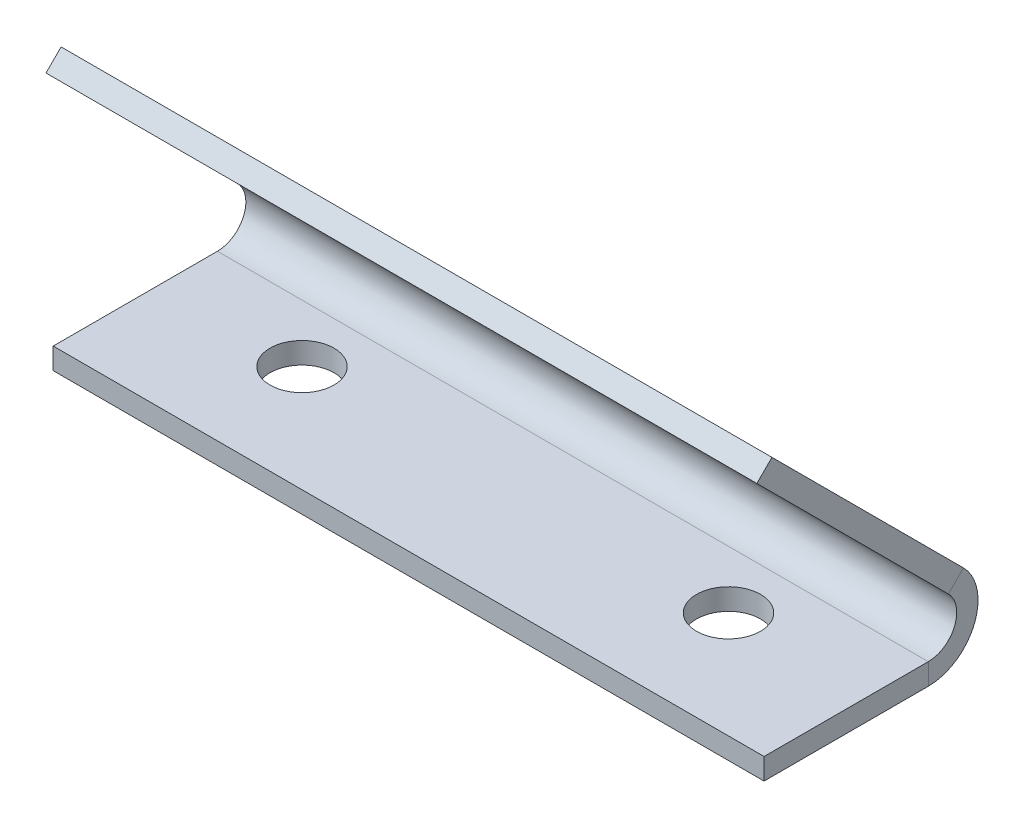
ISO-10303-21;
HEADER;
FILE_DESCRIPTION(('STEP AP214'),'2;1');
FILE_NAME('part.step','',(''),(''),'','','');
FILE_SCHEMA(('AUTOMOTIVE_DESIGN { 1 0 10303 214 1 1 1 1 }'));
ENDSEC;
DATA;
#1=APPLICATION_CONTEXT('core data for automotive mechanical design processes');
#2=APPLICATION_PROTOCOL_DEFINITION('international standard','automotive_design',2000,#1);
#3=PRODUCT_CONTEXT('',#1,'mechanical');
#4=PRODUCT('Part','Part','',(#3));
#5=PRODUCT_RELATED_PRODUCT_CATEGORY('part','',(#4));
#6=PRODUCT_DEFINITION_FORMATION('','',#4);
#7=PRODUCT_DEFINITION_CONTEXT('part definition',#1,'design');
#8=PRODUCT_DEFINITION('design','',#6,#7);
#9=PRODUCT_DEFINITION_SHAPE('','',#8);
#10=(LENGTH_UNIT() NAMED_UNIT(*) SI_UNIT(.MILLI.,.METRE.));
#11=(NAMED_UNIT(*) PLANE_ANGLE_UNIT() SI_UNIT($,.RADIAN.));
#12=(NAMED_UNIT(*) SI_UNIT($,.STERADIAN.) SOLID_ANGLE_UNIT());
#13=UNCERTAINTY_MEASURE_WITH_UNIT(LENGTH_MEASURE(1.E-05),#10,'distance_accuracy_value','');
#14=(GEOMETRIC_REPRESENTATION_CONTEXT(3) GLOBAL_UNCERTAINTY_ASSIGNED_CONTEXT((#13)) GLOBAL_UNIT_ASSIGNED_CONTEXT((#10,
#11,#12)) REPRESENTATION_CONTEXT('',''));
#15=CARTESIAN_POINT('',(0.,0.,0.));
#16=DIRECTION('',(0.,0.,1.));
#17=DIRECTION('',(1.,0.,0.));
#18=AXIS2_PLACEMENT_3D('',#15,#16,#17);
#19=CARTESIAN_POINT('',(-25.,17.94543648263,15.8241161390705));
#20=DIRECTION('',(1.,0.,0.));
#21=DIRECTION('',(0.,0.707106781186544,0.707106781186551));
#22=AXIS2_PLACEMENT_3D('',#19,#20,#21);
#23=PLANE('',#22);
#24=DIRECTION('',(0.,0.707106781186551,-0.707106781186544));
#25=VECTOR('',#24,1.);
#26=CARTESIAN_POINT('',(-25.,4.47487373415294,2.35355339059333));
#27=LINE('',#26,#25);
#28=CARTESIAN_POINT('',(-25.,3.41421356237311,3.41421356237315));
#29=VERTEX_POINT('',#28);
#30=CARTESIAN_POINT('',(-25.,4.47487373415294,2.35355339059333));
#31=VERTEX_POINT('',#30);
#32=EDGE_CURVE('E11',#29,#31,#27,.T.);
#33=ORIENTED_EDGE('',*,*,#32,.F.);
#34=DIRECTION('',(0.,-0.707106781186544,-0.707106781186551));
#35=VECTOR('',#34,1.);
#36=CARTESIAN_POINT('',(-25.,16.8847763108501,16.8847763108503));
#37=LINE('',#36,#35);
#38=CARTESIAN_POINT('',(-25.,16.8847763108501,16.8847763108503));
#39=VERTEX_POINT('',#38);
#40=EDGE_CURVE('E90',#29,#39,#37,.F.);
#41=ORIENTED_EDGE('',*,*,#40,.T.);
#42=DIRECTION('',(0.,0.707106781186551,-0.707106781186544));
#43=VECTOR('',#42,1.);
#44=CARTESIAN_POINT('',(-25.,17.94543648263,15.8241161390705));
#45=LINE('',#44,#43);
#46=CARTESIAN_POINT('',(-25.,17.94543648263,15.8241161390705));
#47=VERTEX_POINT('',#46);
#48=EDGE_CURVE('E50',#39,#47,#45,.T.);
#49=ORIENTED_EDGE('',*,*,#48,.T.);
#50=DIRECTION('',(0.,0.707106781186544,0.707106781186551));
#51=VECTOR('',#50,1.);
#52=CARTESIAN_POINT('',(-25.,17.94543648263,15.8241161390705));
#53=LINE('',#52,#51);
#54=EDGE_CURVE('E93',#31,#47,#53,.T.);
#55=ORIENTED_EDGE('',*,*,#54,.F.);
#56=EDGE_LOOP('',(#33,#41,#49,#55));
#57=FACE_BOUND('',#56,.T.);
#58=ADVANCED_FACE('F40',(#57),#23,.F.);
#59=CARTESIAN_POINT('',(25.,17.94543648263,15.8241161390705));
#60=DIRECTION('',(0.,0.707106781186544,0.707106781186551));
#61=DIRECTION('',(-1.,0.,0.));
#62=AXIS2_PLACEMENT_3D('',#59,#60,#61);
#63=PLANE('',#62);
#64=ORIENTED_EDGE('',*,*,#48,.F.);
#65=DIRECTION('',(1.,0.,0.));
#66=VECTOR('',#65,1.);
#67=CARTESIAN_POINT('',(25.,16.8847763108501,16.8847763108503));
#68=LINE('',#67,#66);
#69=CARTESIAN_POINT('',(25.,16.8847763108501,16.8847763108503));
#70=VERTEX_POINT('',#69);
#71=EDGE_CURVE('E118',#70,#39,#68,.F.);
#72=ORIENTED_EDGE('',*,*,#71,.F.);
#73=DIRECTION('',(0.,0.707106781186551,-0.707106781186544));
#74=VECTOR('',#73,1.);
#75=CARTESIAN_POINT('',(25.,17.94543648263,15.8241161390705));
#76=LINE('',#75,#74);
#77=CARTESIAN_POINT('',(25.,17.94543648263,15.8241161390705));
#78=VERTEX_POINT('',#77);
#79=EDGE_CURVE('E143',#70,#78,#76,.T.);
#80=ORIENTED_EDGE('',*,*,#79,.T.);
#81=DIRECTION('',(-1.,0.,0.));
#82=VECTOR('',#81,1.);
#83=CARTESIAN_POINT('',(25.,17.94543648263,15.8241161390705));
#84=LINE('',#83,#82);
#85=EDGE_CURVE('E154',#78,#47,#84,.T.);
#86=ORIENTED_EDGE('',*,*,#85,.T.);
#87=EDGE_LOOP('',(#64,#72,#80,#86));
#88=FACE_BOUND('',#87,.T.);
#89=ADVANCED_FACE('F160',(#88),#63,.T.);
#90=CARTESIAN_POINT('',(25.,17.94543648263,15.8241161390705));
#91=DIRECTION('',(1.,0.,0.));
#92=DIRECTION('',(0.,0.707106781186544,0.707106781186551));
#93=AXIS2_PLACEMENT_3D('',#90,#91,#92);
#94=PLANE('',#93);
#95=ORIENTED_EDGE('',*,*,#79,.F.);
#96=DIRECTION('',(0.,-0.707106781186544,-0.707106781186551));
#97=VECTOR('',#96,1.);
#98=CARTESIAN_POINT('',(25.,16.8847763108501,16.8847763108503));
#99=LINE('',#98,#97);
#100=CARTESIAN_POINT('',(25.,3.41421356237311,3.41421356237314));
#101=VERTEX_POINT('',#100);
#102=EDGE_CURVE('E195',#101,#70,#99,.F.);
#103=ORIENTED_EDGE('',*,*,#102,.F.);
#104=DIRECTION('',(0.,0.707106781186552,-0.707106781186543));
#105=VECTOR('',#104,1.);
#106=CARTESIAN_POINT('',(25.,4.47487373415294,2.35355339059333));
#107=LINE('',#106,#105);
#108=CARTESIAN_POINT('',(25.,4.47487373415294,2.35355339059333));
#109=VERTEX_POINT('',#108);
#110=EDGE_CURVE('E140',#101,#109,#107,.T.);
#111=ORIENTED_EDGE('',*,*,#110,.T.);
#112=DIRECTION('',(0.,0.707106781186544,0.707106781186551));
#113=VECTOR('',#112,1.);
#114=CARTESIAN_POINT('',(25.,17.94543648263,15.8241161390705));
#115=LINE('',#114,#113);
#116=EDGE_CURVE('E161',#109,#78,#115,.T.);
#117=ORIENTED_EDGE('',*,*,#116,.T.);
#118=EDGE_LOOP('',(#95,#103,#111,#117));
#119=FACE_BOUND('',#118,.T.);
#120=ADVANCED_FACE('F206',(#119),#94,.T.);
#121=CARTESIAN_POINT('',(25.,2.,4.82842712474623));
#122=DIRECTION('',(-1.,0.,0.));
#123=DIRECTION('',(0.,0.,1.));
#124=AXIS2_PLACEMENT_3D('',#121,#122,#123);
#125=PLANE('',#124);
#126=ORIENTED_EDGE('',*,*,#110,.F.);
#127=CARTESIAN_POINT('',(25.,2.,4.82842712474623));
#128=DIRECTION('',(-1.,0.,0.));
#129=DIRECTION('',(0.,0.,1.));
#130=AXIS2_PLACEMENT_3D('',#127,#128,#129);
#131=CIRCLE('',#130,2.);
#132=CARTESIAN_POINT('',(25.,0.,4.82842712474623));
#133=VERTEX_POINT('',#132);
#134=EDGE_CURVE('E108',#101,#133,#131,.T.);
#135=ORIENTED_EDGE('',*,*,#134,.T.);
#136=DIRECTION('',(0.,-1.,0.));
#137=VECTOR('',#136,1.);
#138=CARTESIAN_POINT('',(25.,-1.5,4.82842712474623));
#139=LINE('',#138,#137);
#140=CARTESIAN_POINT('',(25.,-1.5,4.82842712474623));
#141=VERTEX_POINT('',#140);
#142=EDGE_CURVE('E58',#133,#141,#139,.T.);
#143=ORIENTED_EDGE('',*,*,#142,.T.);
#144=CARTESIAN_POINT('',(25.,2.,4.82842712474623));
#145=DIRECTION('',(1.,0.,0.));
#146=DIRECTION('',(0.,0.,-1.));
#147=AXIS2_PLACEMENT_3D('',#144,#145,#146);
#148=CIRCLE('',#147,3.5);
#149=EDGE_CURVE('E187',#109,#141,#148,.F.);
#150=ORIENTED_EDGE('',*,*,#149,.F.);
#151=EDGE_LOOP('',(#126,#135,#143,#150));
#152=FACE_BOUND('',#151,.T.);
#153=ADVANCED_FACE('F209',(#152),#125,.F.);
#154=CARTESIAN_POINT('',(25.,-1.5,-3.62132034355967));
#155=DIRECTION('',(1.,0.,0.));
#156=DIRECTION('',(0.,0.,-1.));
#157=AXIS2_PLACEMENT_3D('',#154,#155,#156);
#158=PLANE('',#157);
#159=ORIENTED_EDGE('',*,*,#142,.F.);
#160=DIRECTION('',(0.,0.,1.));
#161=VECTOR('',#160,1.);
#162=CARTESIAN_POINT('',(25.,0.,-3.62132034355967));
#163=LINE('',#162,#161);
#164=CARTESIAN_POINT('',(25.,0.,16.3786796564403));
#165=VERTEX_POINT('',#164);
#166=EDGE_CURVE('E200',#165,#133,#163,.F.);
#167=ORIENTED_EDGE('',*,*,#166,.F.);
#168=DIRECTION('',(0.,-1.,0.));
#169=VECTOR('',#168,1.);
#170=CARTESIAN_POINT('',(25.,-1.5,16.3786796564403));
#171=LINE('',#170,#169);
#172=CARTESIAN_POINT('',(25.,-1.5,16.3786796564403));
#173=VERTEX_POINT('',#172);
#174=EDGE_CURVE('E136',#165,#173,#171,.T.);
#175=ORIENTED_EDGE('',*,*,#174,.T.);
#176=DIRECTION('',(0.,0.,-1.));
#177=VECTOR('',#176,1.);
#178=CARTESIAN_POINT('',(25.,-1.5,-3.62132034355967));
#179=LINE('',#178,#177);
#180=EDGE_CURVE('E175',#173,#141,#179,.T.);
#181=ORIENTED_EDGE('',*,*,#180,.T.);
#182=EDGE_LOOP('',(#159,#167,#175,#181));
#183=FACE_BOUND('',#182,.T.);
#184=ADVANCED_FACE('F220',(#183),#158,.T.);
#185=CARTESIAN_POINT('',(25.,-1.5,16.3786796564403));
#186=DIRECTION('',(0.,0.,-1.));
#187=DIRECTION('',(-1.,0.,0.));
#188=AXIS2_PLACEMENT_3D('',#185,#186,#187);
#189=PLANE('',#188);
#190=ORIENTED_EDGE('',*,*,#174,.F.);
#191=DIRECTION('',(1.,0.,0.));
#192=VECTOR('',#191,1.);
#193=CARTESIAN_POINT('',(25.,0.,16.3786796564403));
#194=LINE('',#193,#192);
#195=CARTESIAN_POINT('',(-25.,0.,16.3786796564403));
#196=VERTEX_POINT('',#195);
#197=EDGE_CURVE('E113',#165,#196,#194,.F.);
#198=ORIENTED_EDGE('',*,*,#197,.T.);
#199=DIRECTION('',(0.,-1.,0.));
#200=VECTOR('',#199,1.);
#201=CARTESIAN_POINT('',(-25.,-1.5,16.3786796564403));
#202=LINE('',#201,#200);
#203=CARTESIAN_POINT('',(-25.,-1.5,16.3786796564403));
#204=VERTEX_POINT('',#203);
#205=EDGE_CURVE('E133',#196,#204,#202,.T.);
#206=ORIENTED_EDGE('',*,*,#205,.T.);
#207=DIRECTION('',(-1.,0.,0.));
#208=VECTOR('',#207,1.);
#209=CARTESIAN_POINT('',(25.,-1.5,16.3786796564403));
#210=LINE('',#209,#208);
#211=EDGE_CURVE('E178',#173,#204,#210,.T.);
#212=ORIENTED_EDGE('',*,*,#211,.F.);
#213=EDGE_LOOP('',(#190,#198,#206,#212));
#214=FACE_BOUND('',#213,.T.);
#215=ADVANCED_FACE('F226',(#214),#189,.F.);
#216=CARTESIAN_POINT('',(-25.,-1.5,-3.62132034355967));
#217=DIRECTION('',(1.,0.,0.));
#218=DIRECTION('',(0.,0.,-1.));
#219=AXIS2_PLACEMENT_3D('',#216,#217,#218);
#220=PLANE('',#219);
#221=ORIENTED_EDGE('',*,*,#205,.F.);
#222=DIRECTION('',(0.,0.,1.));
#223=VECTOR('',#222,1.);
#224=CARTESIAN_POINT('',(-25.,0.,-3.62132034355967));
#225=LINE('',#224,#223);
#226=CARTESIAN_POINT('',(-25.,0.,4.82842712474623));
#227=VERTEX_POINT('',#226);
#228=EDGE_CURVE('E198',#196,#227,#225,.F.);
#229=ORIENTED_EDGE('',*,*,#228,.T.);
#230=DIRECTION('',(0.,-1.,0.));
#231=VECTOR('',#230,1.);
#232=CARTESIAN_POINT('',(-25.,-1.5,4.82842712474623));
#233=LINE('',#232,#231);
#234=CARTESIAN_POINT('',(-25.,-1.5,4.82842712474623));
#235=VERTEX_POINT('',#234);
#236=EDGE_CURVE('E44',#227,#235,#233,.T.);
#237=ORIENTED_EDGE('',*,*,#236,.T.);
#238=DIRECTION('',(0.,0.,-1.));
#239=VECTOR('',#238,1.);
#240=CARTESIAN_POINT('',(-25.,-1.5,-3.62132034355967));
#241=LINE('',#240,#239);
#242=EDGE_CURVE('E172',#204,#235,#241,.T.);
#243=ORIENTED_EDGE('',*,*,#242,.F.);
#244=EDGE_LOOP('',(#221,#229,#237,#243));
#245=FACE_BOUND('',#244,.T.);
#246=ADVANCED_FACE('F230',(#245),#220,.F.);
#247=CARTESIAN_POINT('',(-15.,12.6421356237309,10.5208152801714));
#248=DIRECTION('',(0.,-0.707106781186551,0.707106781186544));
#249=DIRECTION('',(0.,-0.707106781186544,-0.707106781186551));
#250=AXIS2_PLACEMENT_3D('',#247,#248,#249);
#251=CYLINDRICAL_SURFACE('',#250,2.25);
#252=CARTESIAN_POINT('',(-15.,12.6421356237309,10.5208152801714));
#253=DIRECTION('',(0.,0.707106781186551,-0.707106781186544));
#254=DIRECTION('',(0.,0.707106781186544,0.707106781186551));
#255=AXIS2_PLACEMENT_3D('',#252,#253,#254);
#256=CIRCLE('',#255,2.25);
#257=CARTESIAN_POINT('',(-15.,14.2331258814006,12.1118055378411));
#258=VERTEX_POINT('',#257);
#259=EDGE_CURVE('E189',#258,#258,#256,.T.);
#260=ORIENTED_EDGE('',*,*,#259,.T.);
#261=EDGE_LOOP('',(#260));
#262=FACE_BOUND('',#261,.T.);
#263=CARTESIAN_POINT('',(-15.,11.581475451951,11.5814754519512));
#264=DIRECTION('',(0.,0.707106781186551,-0.707106781186544));
#265=DIRECTION('',(0.,0.707106781186544,0.707106781186551));
#266=AXIS2_PLACEMENT_3D('',#263,#264,#265);
#267=CIRCLE('',#266,2.25);
#268=CARTESIAN_POINT('',(-15.,13.1724657096208,13.1724657096209));
#269=VERTEX_POINT('',#268);
#270=EDGE_CURVE('E125',#269,#269,#267,.T.);
#271=ORIENTED_EDGE('',*,*,#270,.F.);
#272=EDGE_LOOP('',(#271));
#273=FACE_BOUND('',#272,.T.);
#274=ADVANCED_FACE('F254',(#262,#273),#251,.F.);
#275=CARTESIAN_POINT('',(15.,12.6421356237309,10.5208152801714));
#276=DIRECTION('',(0.,-0.707106781186551,0.707106781186544));
#277=DIRECTION('',(0.,-0.707106781186544,-0.707106781186551));
#278=AXIS2_PLACEMENT_3D('',#275,#276,#277);
#279=CYLINDRICAL_SURFACE('',#278,2.25);
#280=CARTESIAN_POINT('',(15.,12.6421356237309,10.5208152801714));
#281=DIRECTION('',(0.,0.707106781186551,-0.707106781186544));
#282=DIRECTION('',(0.,0.707106781186544,0.707106781186551));
#283=AXIS2_PLACEMENT_3D('',#280,#281,#282);
#284=CIRCLE('',#283,2.25);
#285=CARTESIAN_POINT('',(15.,14.2331258814006,12.1118055378411));
#286=VERTEX_POINT('',#285);
#287=EDGE_CURVE('E158',#286,#286,#284,.T.);
#288=ORIENTED_EDGE('',*,*,#287,.T.);
#289=EDGE_LOOP('',(#288));
#290=FACE_BOUND('',#289,.T.);
#291=CARTESIAN_POINT('',(15.,11.581475451951,11.5814754519512));
#292=DIRECTION('',(0.,0.707106781186551,-0.707106781186544));
#293=DIRECTION('',(0.,0.707106781186544,0.707106781186551));
#294=AXIS2_PLACEMENT_3D('',#291,#292,#293);
#295=CIRCLE('',#294,2.25);
#296=CARTESIAN_POINT('',(15.,13.1724657096208,13.1724657096209));
#297=VERTEX_POINT('',#296);
#298=EDGE_CURVE('E119',#297,#297,#295,.T.);
#299=ORIENTED_EDGE('',*,*,#298,.F.);
#300=EDGE_LOOP('',(#299));
#301=FACE_BOUND('',#300,.T.);
#302=ADVANCED_FACE('F42',(#290,#301),#279,.F.);
#303=CARTESIAN_POINT('',(-15.,-1.5,8.87867965644033));
#304=DIRECTION('',(0.,1.,0.));
#305=DIRECTION('',(0.,0.,1.));
#306=AXIS2_PLACEMENT_3D('',#303,#304,#305);
#307=CYLINDRICAL_SURFACE('',#306,2.25);
#308=CARTESIAN_POINT('',(-15.,-1.5,8.87867965644033));
#309=DIRECTION('',(0.,-1.,0.));
#310=DIRECTION('',(0.,0.,-1.));
#311=AXIS2_PLACEMENT_3D('',#308,#309,#310);
#312=CIRCLE('',#311,2.25);
#313=CARTESIAN_POINT('',(-15.,-1.5,6.62867965644033));
#314=VERTEX_POINT('',#313);
#315=EDGE_CURVE('E163',#314,#314,#312,.T.);
#316=ORIENTED_EDGE('',*,*,#315,.T.);
#317=EDGE_LOOP('',(#316));
#318=FACE_BOUND('',#317,.T.);
#319=CARTESIAN_POINT('',(-15.,0.,8.87867965644033));
#320=DIRECTION('',(0.,-1.,0.));
#321=DIRECTION('',(0.,0.,-1.));
#322=AXIS2_PLACEMENT_3D('',#319,#320,#321);
#323=CIRCLE('',#322,2.25);
#324=CARTESIAN_POINT('',(-15.,0.,6.62867965644033));
#325=VERTEX_POINT('',#324);
#326=EDGE_CURVE('E191',#325,#325,#323,.T.);
#327=ORIENTED_EDGE('',*,*,#326,.F.);
#328=EDGE_LOOP('',(#327));
#329=FACE_BOUND('',#328,.T.);
#330=ADVANCED_FACE('F261',(#318,#329),#307,.F.);
#331=CARTESIAN_POINT('',(15.,-1.5,8.87867965644033));
#332=DIRECTION('',(0.,1.,0.));
#333=DIRECTION('',(0.,0.,1.));
#334=AXIS2_PLACEMENT_3D('',#331,#332,#333);
#335=CYLINDRICAL_SURFACE('',#334,2.25);
#336=CARTESIAN_POINT('',(15.,-1.5,8.87867965644033));
#337=DIRECTION('',(0.,-1.,0.));
#338=DIRECTION('',(0.,0.,-1.));
#339=AXIS2_PLACEMENT_3D('',#336,#337,#338);
#340=CIRCLE('',#339,2.25);
#341=CARTESIAN_POINT('',(15.,-1.5,6.62867965644032));
#342=VERTEX_POINT('',#341);
#343=EDGE_CURVE('E169',#342,#342,#340,.T.);
#344=ORIENTED_EDGE('',*,*,#343,.T.);
#345=EDGE_LOOP('',(#344));
#346=FACE_BOUND('',#345,.T.);
#347=CARTESIAN_POINT('',(15.,0.,8.87867965644033));
#348=DIRECTION('',(0.,-1.,0.));
#349=DIRECTION('',(0.,0.,-1.));
#350=AXIS2_PLACEMENT_3D('',#347,#348,#349);
#351=CIRCLE('',#350,2.25);
#352=CARTESIAN_POINT('',(15.,0.,6.62867965644032));
#353=VERTEX_POINT('',#352);
#354=EDGE_CURVE('E194',#353,#353,#351,.T.);
#355=ORIENTED_EDGE('',*,*,#354,.F.);
#356=EDGE_LOOP('',(#355));
#357=FACE_BOUND('',#356,.T.);
#358=ADVANCED_FACE('F253',(#346,#357),#335,.F.);
#359=CARTESIAN_POINT('',(-25.,2.,4.82842712474623));
#360=DIRECTION('',(1.,0.,0.));
#361=DIRECTION('',(0.,0.,-1.));
#362=AXIS2_PLACEMENT_3D('',#359,#360,#361);
#363=PLANE('',#362);
#364=CARTESIAN_POINT('',(-25.,2.,4.82842712474623));
#365=DIRECTION('',(-1.,0.,0.));
#366=DIRECTION('',(0.,0.,1.));
#367=AXIS2_PLACEMENT_3D('',#364,#365,#366);
#368=CIRCLE('',#367,2.);
#369=EDGE_CURVE('E106',#227,#29,#368,.F.);
#370=ORIENTED_EDGE('',*,*,#369,.T.);
#371=ORIENTED_EDGE('',*,*,#32,.T.);
#372=CARTESIAN_POINT('',(-25.,2.,4.82842712474623));
#373=DIRECTION('',(-1.,0.,0.));
#374=DIRECTION('',(0.,0.,1.));
#375=AXIS2_PLACEMENT_3D('',#372,#373,#374);
#376=CIRCLE('',#375,3.5);
#377=EDGE_CURVE('E185',#235,#31,#376,.F.);
#378=ORIENTED_EDGE('',*,*,#377,.F.);
#379=ORIENTED_EDGE('',*,*,#236,.F.);
#380=EDGE_LOOP('',(#370,#371,#378,#379));
#381=FACE_BOUND('',#380,.T.);
#382=ADVANCED_FACE('F122',(#381),#363,.F.);
#383=CARTESIAN_POINT('',(25.,-1.5,-3.62132034355967));
#384=DIRECTION('',(0.,1.,0.));
#385=DIRECTION('',(0.,0.,1.));
#386=AXIS2_PLACEMENT_3D('',#383,#384,#385);
#387=PLANE('',#386);
#388=ORIENTED_EDGE('',*,*,#315,.F.);
#389=EDGE_LOOP('',(#388));
#390=FACE_BOUND('',#389,.T.);
#391=ORIENTED_EDGE('',*,*,#343,.F.);
#392=EDGE_LOOP('',(#391));
#393=FACE_BOUND('',#392,.T.);
#394=ORIENTED_EDGE('',*,*,#242,.T.);
#395=DIRECTION('',(-1.,0.,0.));
#396=VECTOR('',#395,1.);
#397=CARTESIAN_POINT('',(25.,-1.5,4.82842712474623));
#398=LINE('',#397,#396);
#399=EDGE_CURVE('E182',#235,#141,#398,.F.);
#400=ORIENTED_EDGE('',*,*,#399,.T.);
#401=ORIENTED_EDGE('',*,*,#180,.F.);
#402=ORIENTED_EDGE('',*,*,#211,.T.);
#403=EDGE_LOOP('',(#394,#400,#401,#402));
#404=FACE_BOUND('',#403,.T.);
#405=ADVANCED_FACE('F225',(#390,#393,#404),#387,.F.);
#406=CARTESIAN_POINT('',(25.,17.94543648263,15.8241161390705));
#407=DIRECTION('',(0.,-0.707106781186551,0.707106781186544));
#408=DIRECTION('',(0.,-0.707106781186544,-0.707106781186551));
#409=AXIS2_PLACEMENT_3D('',#406,#407,#408);
#410=PLANE('',#409);
#411=ORIENTED_EDGE('',*,*,#259,.F.);
#412=EDGE_LOOP('',(#411));
#413=FACE_BOUND('',#412,.T.);
#414=ORIENTED_EDGE('',*,*,#287,.F.);
#415=EDGE_LOOP('',(#414));
#416=FACE_BOUND('',#415,.T.);
#417=ORIENTED_EDGE('',*,*,#116,.F.);
#418=DIRECTION('',(-1.,0.,0.));
#419=VECTOR('',#418,1.);
#420=CARTESIAN_POINT('',(25.,4.47487373415293,2.35355339059333));
#421=LINE('',#420,#419);
#422=EDGE_CURVE('E157',#109,#31,#421,.T.);
#423=ORIENTED_EDGE('',*,*,#422,.T.);
#424=ORIENTED_EDGE('',*,*,#54,.T.);
#425=ORIENTED_EDGE('',*,*,#85,.F.);
#426=EDGE_LOOP('',(#417,#423,#424,#425));
#427=FACE_BOUND('',#426,.T.);
#428=ADVANCED_FACE('F153',(#413,#416,#427),#410,.F.);
#429=CARTESIAN_POINT('',(25.,2.,4.82842712474623));
#430=DIRECTION('',(-1.,0.,0.));
#431=DIRECTION('',(0.,0.,1.));
#432=AXIS2_PLACEMENT_3D('',#429,#430,#431);
#433=CYLINDRICAL_SURFACE('',#432,3.5);
#434=ORIENTED_EDGE('',*,*,#149,.T.);
#435=ORIENTED_EDGE('',*,*,#399,.F.);
#436=ORIENTED_EDGE('',*,*,#377,.T.);
#437=ORIENTED_EDGE('',*,*,#422,.F.);
#438=EDGE_LOOP('',(#434,#435,#436,#437));
#439=FACE_BOUND('',#438,.T.);
#440=ADVANCED_FACE('F212',(#439),#433,.T.);
#441=CARTESIAN_POINT('',(25.,0.,-3.62132034355967));
#442=DIRECTION('',(0.,1.,0.));
#443=DIRECTION('',(0.,0.,1.));
#444=AXIS2_PLACEMENT_3D('',#441,#442,#443);
#445=PLANE('',#444);
#446=ORIENTED_EDGE('',*,*,#326,.T.);
#447=EDGE_LOOP('',(#446));
#448=FACE_BOUND('',#447,.T.);
#449=ORIENTED_EDGE('',*,*,#354,.T.);
#450=EDGE_LOOP('',(#449));
#451=FACE_BOUND('',#450,.T.);
#452=ORIENTED_EDGE('',*,*,#228,.F.);
#453=ORIENTED_EDGE('',*,*,#197,.F.);
#454=ORIENTED_EDGE('',*,*,#166,.T.);
#455=DIRECTION('',(1.,0.,0.));
#456=VECTOR('',#455,1.);
#457=CARTESIAN_POINT('',(25.,0.,4.82842712474623));
#458=LINE('',#457,#456);
#459=EDGE_CURVE('E112',#227,#133,#458,.T.);
#460=ORIENTED_EDGE('',*,*,#459,.F.);
#461=EDGE_LOOP('',(#452,#453,#454,#460));
#462=FACE_BOUND('',#461,.T.);
#463=ADVANCED_FACE('F232',(#448,#451,#462),#445,.T.);
#464=CARTESIAN_POINT('',(25.,16.8847763108501,16.8847763108503));
#465=DIRECTION('',(0.,-0.707106781186551,0.707106781186544));
#466=DIRECTION('',(0.,-0.707106781186544,-0.707106781186551));
#467=AXIS2_PLACEMENT_3D('',#464,#465,#466);
#468=PLANE('',#467);
#469=ORIENTED_EDGE('',*,*,#270,.T.);
#470=EDGE_LOOP('',(#469));
#471=FACE_BOUND('',#470,.T.);
#472=ORIENTED_EDGE('',*,*,#298,.T.);
#473=EDGE_LOOP('',(#472));
#474=FACE_BOUND('',#473,.T.);
#475=ORIENTED_EDGE('',*,*,#102,.T.);
#476=ORIENTED_EDGE('',*,*,#71,.T.);
#477=ORIENTED_EDGE('',*,*,#40,.F.);
#478=DIRECTION('',(1.,0.,0.));
#479=VECTOR('',#478,1.);
#480=CARTESIAN_POINT('',(25.,3.41421356237311,3.41421356237314));
#481=LINE('',#480,#479);
#482=EDGE_CURVE('E103',#101,#29,#481,.F.);
#483=ORIENTED_EDGE('',*,*,#482,.F.);
#484=EDGE_LOOP('',(#475,#476,#477,#483));
#485=FACE_BOUND('',#484,.T.);
#486=ADVANCED_FACE('F116',(#471,#474,#485),#468,.T.);
#487=CARTESIAN_POINT('',(25.,2.,4.82842712474623));
#488=DIRECTION('',(-1.,0.,0.));
#489=DIRECTION('',(0.,0.,1.));
#490=AXIS2_PLACEMENT_3D('',#487,#488,#489);
#491=CYLINDRICAL_SURFACE('',#490,2.);
#492=ORIENTED_EDGE('',*,*,#134,.F.);
#493=ORIENTED_EDGE('',*,*,#482,.T.);
#494=ORIENTED_EDGE('',*,*,#369,.F.);
#495=ORIENTED_EDGE('',*,*,#459,.T.);
#496=EDGE_LOOP('',(#492,#493,#494,#495));
#497=FACE_BOUND('',#496,.T.);
#498=ADVANCED_FACE('F104',(#497),#491,.F.);
#499=CLOSED_SHELL('',(#58,#89,#120,#153,#184,#215,#246,#274,#302,#330,#358,#382,#405,#428,#440,
#463,#486,#498));
#500=MANIFOLD_SOLID_BREP('B2',#499);
#501=ADVANCED_BREP_SHAPE_REPRESENTATION('',(#18,#500),#14);
#502=SHAPE_DEFINITION_REPRESENTATION(#9,#501);
ENDSEC;
END-ISO-10303-21;
